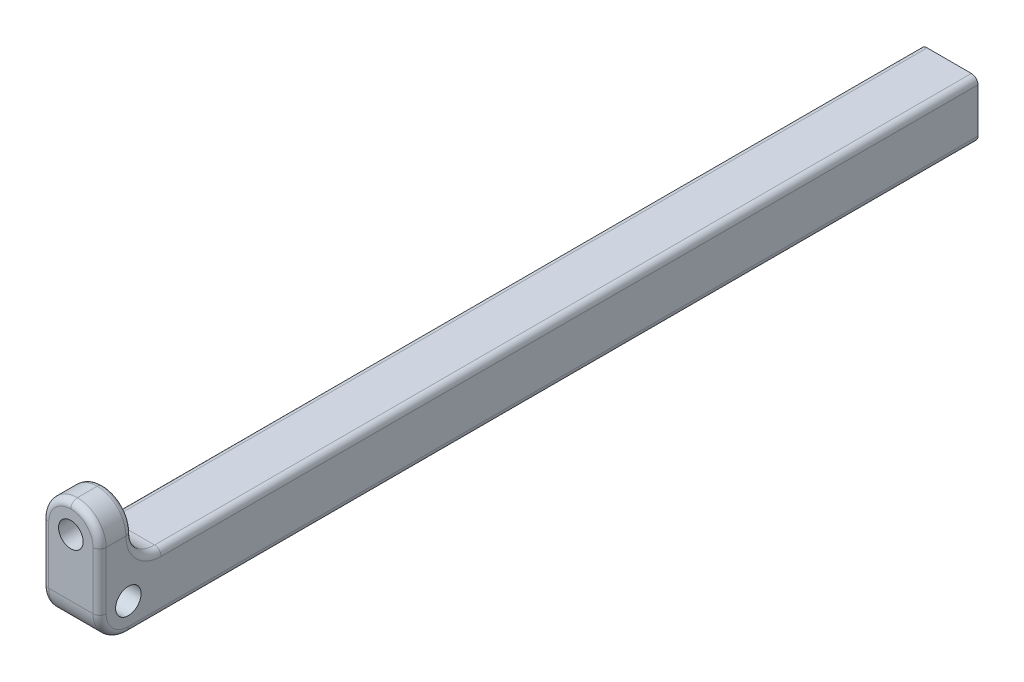
ISO-10303-21;
HEADER;
FILE_DESCRIPTION(('STEP AP214'),'2;1');
FILE_NAME('part.step','',(''),(''),'','','');
FILE_SCHEMA(('AUTOMOTIVE_DESIGN { 1 0 10303 214 1 1 1 1 }'));
ENDSEC;
DATA;
#1=APPLICATION_CONTEXT('core data for automotive mechanical design processes');
#2=APPLICATION_PROTOCOL_DEFINITION('international standard','automotive_design',2000,#1);
#3=PRODUCT_CONTEXT('',#1,'mechanical');
#4=PRODUCT('Part','Part','',(#3));
#5=PRODUCT_RELATED_PRODUCT_CATEGORY('part','',(#4));
#6=PRODUCT_DEFINITION_FORMATION('','',#4);
#7=PRODUCT_DEFINITION_CONTEXT('part definition',#1,'design');
#8=PRODUCT_DEFINITION('design','',#6,#7);
#9=PRODUCT_DEFINITION_SHAPE('','',#8);
#10=(LENGTH_UNIT() NAMED_UNIT(*) SI_UNIT(.MILLI.,.METRE.));
#11=(NAMED_UNIT(*) PLANE_ANGLE_UNIT() SI_UNIT($,.RADIAN.));
#12=(NAMED_UNIT(*) SI_UNIT($,.STERADIAN.) SOLID_ANGLE_UNIT());
#13=UNCERTAINTY_MEASURE_WITH_UNIT(LENGTH_MEASURE(1.E-05),#10,'distance_accuracy_value','');
#14=(GEOMETRIC_REPRESENTATION_CONTEXT(3) GLOBAL_UNCERTAINTY_ASSIGNED_CONTEXT((#13)) GLOBAL_UNIT_ASSIGNED_CONTEXT((#10,
#11,#12)) REPRESENTATION_CONTEXT('',''));
#15=CARTESIAN_POINT('',(0.,0.,0.));
#16=DIRECTION('',(0.,0.,1.));
#17=DIRECTION('',(1.,0.,0.));
#18=AXIS2_PLACEMENT_3D('',#15,#16,#17);
#19=CARTESIAN_POINT('',(-3.5,3.5,107.));
#20=DIRECTION('',(0.,-1.,0.));
#21=DIRECTION('',(0.,0.,-1.));
#22=AXIS2_PLACEMENT_3D('',#19,#20,#21);
#23=PLANE('',#22);
#24=DIRECTION('',(-1.,0.,0.));
#25=VECTOR('',#24,1.);
#26=CARTESIAN_POINT('',(3.5,3.5,99.5));
#27=LINE('',#26,#25);
#28=CARTESIAN_POINT('',(-2.7,3.5,99.5));
#29=VERTEX_POINT('',#28);
#30=CARTESIAN_POINT('',(2.7,3.5,99.5));
#31=VERTEX_POINT('',#30);
#32=EDGE_CURVE('E162',#29,#31,#27,.F.);
#33=ORIENTED_EDGE('',*,*,#32,.T.);
#34=DIRECTION('',(0.,0.,-1.));
#35=VECTOR('',#34,1.);
#36=CARTESIAN_POINT('',(2.7,3.5,107.));
#37=LINE('',#36,#35);
#38=CARTESIAN_POINT('',(2.7,3.5,0.));
#39=VERTEX_POINT('',#38);
#40=EDGE_CURVE('E623',#31,#39,#37,.T.);
#41=ORIENTED_EDGE('',*,*,#40,.T.);
#42=DIRECTION('',(-1.,0.,0.));
#43=VECTOR('',#42,1.);
#44=CARTESIAN_POINT('',(-3.5,3.5,0.));
#45=LINE('',#44,#43);
#46=CARTESIAN_POINT('',(-2.7,3.5,0.));
#47=VERTEX_POINT('',#46);
#48=EDGE_CURVE('E394',#39,#47,#45,.T.);
#49=ORIENTED_EDGE('',*,*,#48,.T.);
#50=DIRECTION('',(0.,0.,-1.));
#51=VECTOR('',#50,1.);
#52=CARTESIAN_POINT('',(-2.7,3.5,107.));
#53=LINE('',#52,#51);
#54=EDGE_CURVE('E161',#47,#29,#53,.F.);
#55=ORIENTED_EDGE('',*,*,#54,.T.);
#56=EDGE_LOOP('',(#33,#41,#49,#55));
#57=FACE_BOUND('',#56,.T.);
#58=ADVANCED_FACE('F35',(#57),#23,.F.);
#59=CARTESIAN_POINT('',(3.5,3.5,107.));
#60=DIRECTION('',(-1.,0.,0.));
#61=DIRECTION('',(0.,-1.,0.));
#62=AXIS2_PLACEMENT_3D('',#59,#60,#61);
#63=PLANE('',#62);
#64=CARTESIAN_POINT('',(3.5,0.,103.5));
#65=DIRECTION('',(1.,0.,0.));
#66=DIRECTION('',(0.,1.,0.));
#67=AXIS2_PLACEMENT_3D('',#64,#65,#66);
#68=CIRCLE('',#67,1.54999999999999);
#69=CARTESIAN_POINT('',(3.5,1.54999999999999,103.5));
#70=VERTEX_POINT('',#69);
#71=EDGE_CURVE('E294',#70,#70,#68,.T.);
#72=ORIENTED_EDGE('',*,*,#71,.F.);
#73=EDGE_LOOP('',(#72));
#74=FACE_BOUND('',#73,.T.);
#75=CARTESIAN_POINT('',(3.5,0.,103.5));
#76=DIRECTION('',(-1.,0.,0.));
#77=DIRECTION('',(0.,-1.,0.));
#78=AXIS2_PLACEMENT_3D('',#75,#76,#77);
#79=CIRCLE('',#78,2.7);
#80=CARTESIAN_POINT('',(3.5,0.,106.2));
#81=VERTEX_POINT('',#80);
#82=CARTESIAN_POINT('',(3.5,-2.7,103.5));
#83=VERTEX_POINT('',#82);
#84=EDGE_CURVE('E353',#81,#83,#79,.F.);
#85=ORIENTED_EDGE('',*,*,#84,.T.);
#86=DIRECTION('',(0.,0.,-1.));
#87=VECTOR('',#86,1.);
#88=CARTESIAN_POINT('',(3.5,-2.7,107.));
#89=LINE('',#88,#87);
#90=CARTESIAN_POINT('',(3.5,-2.7,0.));
#91=VERTEX_POINT('',#90);
#92=EDGE_CURVE('E355',#83,#91,#89,.T.);
#93=ORIENTED_EDGE('',*,*,#92,.T.);
#94=DIRECTION('',(0.,1.,0.));
#95=VECTOR('',#94,1.);
#96=CARTESIAN_POINT('',(3.5,3.5,0.));
#97=LINE('',#96,#95);
#98=CARTESIAN_POINT('',(3.5,2.7,0.));
#99=VERTEX_POINT('',#98);
#100=EDGE_CURVE('E397',#91,#99,#97,.T.);
#101=ORIENTED_EDGE('',*,*,#100,.T.);
#102=DIRECTION('',(0.,0.,-1.));
#103=VECTOR('',#102,1.);
#104=CARTESIAN_POINT('',(3.5,2.7,107.));
#105=LINE('',#104,#103);
#106=CARTESIAN_POINT('',(3.5,2.7,99.5));
#107=VERTEX_POINT('',#106);
#108=EDGE_CURVE('E630',#99,#107,#105,.F.);
#109=ORIENTED_EDGE('',*,*,#108,.T.);
#110=CARTESIAN_POINT('',(3.5,7.,99.5));
#111=DIRECTION('',(-1.,0.,0.));
#112=DIRECTION('',(0.,-1.,0.));
#113=AXIS2_PLACEMENT_3D('',#110,#111,#112);
#114=CIRCLE('',#113,4.3);
#115=CARTESIAN_POINT('',(3.5,7.,103.8));
#116=VERTEX_POINT('',#115);
#117=EDGE_CURVE('E381',#107,#116,#114,.T.);
#118=ORIENTED_EDGE('',*,*,#117,.T.);
#119=DIRECTION('',(0.,0.,-1.));
#120=VECTOR('',#119,1.);
#121=CARTESIAN_POINT('',(3.5,7.,107.));
#122=LINE('',#121,#120);
#123=CARTESIAN_POINT('',(3.5,7.,106.2));
#124=VERTEX_POINT('',#123);
#125=EDGE_CURVE('E180',#116,#124,#122,.F.);
#126=ORIENTED_EDGE('',*,*,#125,.T.);
#127=DIRECTION('',(0.,1.,0.));
#128=VECTOR('',#127,1.);
#129=CARTESIAN_POINT('',(3.5,0.,106.2));
#130=LINE('',#129,#128);
#131=EDGE_CURVE('E351',#124,#81,#130,.F.);
#132=ORIENTED_EDGE('',*,*,#131,.T.);
#133=EDGE_LOOP('',(#85,#93,#101,#109,#118,#126,#132));
#134=FACE_BOUND('',#133,.T.);
#135=ADVANCED_FACE('F257',(#74,#134),#63,.F.);
#136=CARTESIAN_POINT('',(-3.5,3.5,107.));
#137=DIRECTION('',(1.,0.,0.));
#138=DIRECTION('',(0.,1.,0.));
#139=AXIS2_PLACEMENT_3D('',#136,#137,#138);
#140=PLANE('',#139);
#141=CARTESIAN_POINT('',(-3.5,0.,103.5));
#142=DIRECTION('',(1.,0.,0.));
#143=DIRECTION('',(0.,1.,0.));
#144=AXIS2_PLACEMENT_3D('',#141,#142,#143);
#145=CIRCLE('',#144,1.54999999999999);
#146=CARTESIAN_POINT('',(-3.5,1.54999999999999,103.5));
#147=VERTEX_POINT('',#146);
#148=EDGE_CURVE('E399',#147,#147,#145,.T.);
#149=ORIENTED_EDGE('',*,*,#148,.T.);
#150=EDGE_LOOP('',(#149));
#151=FACE_BOUND('',#150,.T.);
#152=CARTESIAN_POINT('',(-3.5,0.,103.5));
#153=DIRECTION('',(1.,0.,0.));
#154=DIRECTION('',(0.,1.,0.));
#155=AXIS2_PLACEMENT_3D('',#152,#153,#154);
#156=CIRCLE('',#155,2.7);
#157=CARTESIAN_POINT('',(-3.5,-2.7,103.5));
#158=VERTEX_POINT('',#157);
#159=CARTESIAN_POINT('',(-3.5,0.,106.2));
#160=VERTEX_POINT('',#159);
#161=EDGE_CURVE('E44',#158,#160,#156,.F.);
#162=ORIENTED_EDGE('',*,*,#161,.T.);
#163=DIRECTION('',(0.,-1.,0.));
#164=VECTOR('',#163,1.);
#165=CARTESIAN_POINT('',(-3.5,7.,106.2));
#166=LINE('',#165,#164);
#167=CARTESIAN_POINT('',(-3.5,7.,106.2));
#168=VERTEX_POINT('',#167);
#169=EDGE_CURVE('E11',#160,#168,#166,.F.);
#170=ORIENTED_EDGE('',*,*,#169,.T.);
#171=DIRECTION('',(0.,0.,1.));
#172=VECTOR('',#171,1.);
#173=CARTESIAN_POINT('',(-3.5,7.,107.));
#174=LINE('',#173,#172);
#175=CARTESIAN_POINT('',(-3.5,7.,103.8));
#176=VERTEX_POINT('',#175);
#177=EDGE_CURVE('E177',#168,#176,#174,.F.);
#178=ORIENTED_EDGE('',*,*,#177,.T.);
#179=CARTESIAN_POINT('',(-3.5,7.,99.5));
#180=DIRECTION('',(1.,0.,0.));
#181=DIRECTION('',(0.,1.,0.));
#182=AXIS2_PLACEMENT_3D('',#179,#180,#181);
#183=CIRCLE('',#182,4.3);
#184=CARTESIAN_POINT('',(-3.5,2.7,99.5));
#185=VERTEX_POINT('',#184);
#186=EDGE_CURVE('E341',#176,#185,#183,.T.);
#187=ORIENTED_EDGE('',*,*,#186,.T.);
#188=DIRECTION('',(0.,0.,-1.));
#189=VECTOR('',#188,1.);
#190=CARTESIAN_POINT('',(-3.5,2.7,107.));
#191=LINE('',#190,#189);
#192=CARTESIAN_POINT('',(-3.5,2.7,0.));
#193=VERTEX_POINT('',#192);
#194=EDGE_CURVE('E602',#185,#193,#191,.T.);
#195=ORIENTED_EDGE('',*,*,#194,.T.);
#196=DIRECTION('',(0.,-1.,0.));
#197=VECTOR('',#196,1.);
#198=CARTESIAN_POINT('',(-3.5,3.5,0.));
#199=LINE('',#198,#197);
#200=CARTESIAN_POINT('',(-3.5,-2.7,0.));
#201=VERTEX_POINT('',#200);
#202=EDGE_CURVE('E392',#193,#201,#199,.T.);
#203=ORIENTED_EDGE('',*,*,#202,.T.);
#204=DIRECTION('',(0.,0.,-1.));
#205=VECTOR('',#204,1.);
#206=CARTESIAN_POINT('',(-3.5,-2.7,107.));
#207=LINE('',#206,#205);
#208=EDGE_CURVE('E55',#201,#158,#207,.F.);
#209=ORIENTED_EDGE('',*,*,#208,.T.);
#210=EDGE_LOOP('',(#162,#170,#178,#187,#195,#203,#209));
#211=FACE_BOUND('',#210,.T.);
#212=ADVANCED_FACE('F263',(#151,#211),#140,.F.);
#213=CARTESIAN_POINT('',(-3.5,-3.5,107.));
#214=DIRECTION('',(0.,1.,0.));
#215=DIRECTION('',(0.,0.,1.));
#216=AXIS2_PLACEMENT_3D('',#213,#214,#215);
#217=PLANE('',#216);
#218=DIRECTION('',(1.,0.,0.));
#219=VECTOR('',#218,1.);
#220=CARTESIAN_POINT('',(-3.5,-3.5,0.));
#221=LINE('',#220,#219);
#222=CARTESIAN_POINT('',(-2.7,-3.5,0.));
#223=VERTEX_POINT('',#222);
#224=CARTESIAN_POINT('',(2.7,-3.5,0.));
#225=VERTEX_POINT('',#224);
#226=EDGE_CURVE('E389',#223,#225,#221,.T.);
#227=ORIENTED_EDGE('',*,*,#226,.T.);
#228=DIRECTION('',(0.,0.,-1.));
#229=VECTOR('',#228,1.);
#230=CARTESIAN_POINT('',(2.7,-3.5,107.));
#231=LINE('',#230,#229);
#232=CARTESIAN_POINT('',(2.7,-3.5,103.5));
#233=VERTEX_POINT('',#232);
#234=EDGE_CURVE('E364',#225,#233,#231,.F.);
#235=ORIENTED_EDGE('',*,*,#234,.T.);
#236=DIRECTION('',(1.,0.,0.));
#237=VECTOR('',#236,1.);
#238=CARTESIAN_POINT('',(-3.5,-3.5,103.5));
#239=LINE('',#238,#237);
#240=CARTESIAN_POINT('',(-2.7,-3.5,103.5));
#241=VERTEX_POINT('',#240);
#242=EDGE_CURVE('E382',#233,#241,#239,.F.);
#243=ORIENTED_EDGE('',*,*,#242,.T.);
#244=DIRECTION('',(0.,0.,-1.));
#245=VECTOR('',#244,1.);
#246=CARTESIAN_POINT('',(-2.7,-3.5,107.));
#247=LINE('',#246,#245);
#248=EDGE_CURVE('E362',#241,#223,#247,.T.);
#249=ORIENTED_EDGE('',*,*,#248,.T.);
#250=EDGE_LOOP('',(#227,#235,#243,#249));
#251=FACE_BOUND('',#250,.T.);
#252=ADVANCED_FACE('F408',(#251),#217,.F.);
#253=CARTESIAN_POINT('',(0.,0.,107.));
#254=DIRECTION('',(0.,0.,1.));
#255=DIRECTION('',(1.,0.,0.));
#256=AXIS2_PLACEMENT_3D('',#253,#254,#255);
#257=PLANE('',#256);
#258=CARTESIAN_POINT('',(0.,7.,107.));
#259=DIRECTION('',(0.,0.,-1.));
#260=DIRECTION('',(-1.,0.,0.));
#261=AXIS2_PLACEMENT_3D('',#258,#259,#260);
#262=CIRCLE('',#261,1.5);
#263=CARTESIAN_POINT('',(-1.5,7.,107.));
#264=VERTEX_POINT('',#263);
#265=EDGE_CURVE('E170',#264,#264,#262,.T.);
#266=ORIENTED_EDGE('',*,*,#265,.T.);
#267=EDGE_LOOP('',(#266));
#268=FACE_BOUND('',#267,.T.);
#269=DIRECTION('',(1.,0.,0.));
#270=VECTOR('',#269,1.);
#271=CARTESIAN_POINT('',(3.5,0.,107.));
#272=LINE('',#271,#270);
#273=CARTESIAN_POINT('',(-2.7,0.,107.));
#274=VERTEX_POINT('',#273);
#275=CARTESIAN_POINT('',(2.7,0.,107.));
#276=VERTEX_POINT('',#275);
#277=EDGE_CURVE('E385',#274,#276,#272,.T.);
#278=ORIENTED_EDGE('',*,*,#277,.T.);
#279=DIRECTION('',(0.,1.,0.));
#280=VECTOR('',#279,1.);
#281=CARTESIAN_POINT('',(2.7,7.,107.));
#282=LINE('',#281,#280);
#283=CARTESIAN_POINT('',(2.7,7.,107.));
#284=VERTEX_POINT('',#283);
#285=EDGE_CURVE('E309',#276,#284,#282,.T.);
#286=ORIENTED_EDGE('',*,*,#285,.T.);
#287=CARTESIAN_POINT('',(0.,7.,107.));
#288=DIRECTION('',(0.,0.,1.));
#289=DIRECTION('',(1.,0.,0.));
#290=AXIS2_PLACEMENT_3D('',#287,#288,#289);
#291=CIRCLE('',#290,2.7);
#292=CARTESIAN_POINT('',(0.,9.7,107.));
#293=VERTEX_POINT('',#292);
#294=EDGE_CURVE('E312',#284,#293,#291,.T.);
#295=ORIENTED_EDGE('',*,*,#294,.T.);
#296=CARTESIAN_POINT('',(0.,7.,107.));
#297=DIRECTION('',(0.,0.,1.));
#298=DIRECTION('',(1.,0.,0.));
#299=AXIS2_PLACEMENT_3D('',#296,#297,#298);
#300=CIRCLE('',#299,2.7);
#301=CARTESIAN_POINT('',(-2.7,7.,107.));
#302=VERTEX_POINT('',#301);
#303=EDGE_CURVE('E301',#293,#302,#300,.T.);
#304=ORIENTED_EDGE('',*,*,#303,.T.);
#305=DIRECTION('',(0.,-1.,0.));
#306=VECTOR('',#305,1.);
#307=CARTESIAN_POINT('',(-2.7,0.,107.));
#308=LINE('',#307,#306);
#309=EDGE_CURVE('E370',#302,#274,#308,.T.);
#310=ORIENTED_EDGE('',*,*,#309,.T.);
#311=EDGE_LOOP('',(#278,#286,#295,#304,#310));
#312=FACE_BOUND('',#311,.T.);
#313=ADVANCED_FACE('F374',(#268,#312),#257,.T.);
#314=CARTESIAN_POINT('',(0.,0.,0.));
#315=DIRECTION('',(0.,0.,1.));
#316=DIRECTION('',(1.,0.,0.));
#317=AXIS2_PLACEMENT_3D('',#314,#315,#316);
#318=PLANE('',#317);
#319=ORIENTED_EDGE('',*,*,#100,.F.);
#320=CARTESIAN_POINT('',(2.7,-2.7,0.));
#321=DIRECTION('',(0.,0.,1.));
#322=DIRECTION('',(1.,0.,0.));
#323=AXIS2_PLACEMENT_3D('',#320,#321,#322);
#324=CIRCLE('',#323,0.8);
#325=EDGE_CURVE('E360',#91,#225,#324,.F.);
#326=ORIENTED_EDGE('',*,*,#325,.T.);
#327=ORIENTED_EDGE('',*,*,#226,.F.);
#328=CARTESIAN_POINT('',(-2.7,-2.7,0.));
#329=DIRECTION('',(0.,0.,1.));
#330=DIRECTION('',(1.,0.,0.));
#331=AXIS2_PLACEMENT_3D('',#328,#329,#330);
#332=CIRCLE('',#331,0.8);
#333=EDGE_CURVE('E358',#223,#201,#332,.F.);
#334=ORIENTED_EDGE('',*,*,#333,.T.);
#335=ORIENTED_EDGE('',*,*,#202,.F.);
#336=CARTESIAN_POINT('',(-2.7,2.7,0.));
#337=DIRECTION('',(0.,0.,1.));
#338=DIRECTION('',(1.,0.,0.));
#339=AXIS2_PLACEMENT_3D('',#336,#337,#338);
#340=CIRCLE('',#339,0.8);
#341=EDGE_CURVE('E620',#193,#47,#340,.F.);
#342=ORIENTED_EDGE('',*,*,#341,.T.);
#343=ORIENTED_EDGE('',*,*,#48,.F.);
#344=CARTESIAN_POINT('',(2.7,2.7,0.));
#345=DIRECTION('',(0.,0.,1.));
#346=DIRECTION('',(1.,0.,0.));
#347=AXIS2_PLACEMENT_3D('',#344,#345,#346);
#348=CIRCLE('',#347,0.8);
#349=EDGE_CURVE('E622',#39,#99,#348,.F.);
#350=ORIENTED_EDGE('',*,*,#349,.T.);
#351=EDGE_LOOP('',(#319,#326,#327,#334,#335,#342,#343,#350));
#352=FACE_BOUND('',#351,.T.);
#353=ADVANCED_FACE('F272',(#352),#318,.F.);
#354=CARTESIAN_POINT('',(0.,0.,103.5));
#355=DIRECTION('',(-1.,0.,0.));
#356=DIRECTION('',(0.,0.,1.));
#357=AXIS2_PLACEMENT_3D('',#354,#355,#356);
#358=CYLINDRICAL_SURFACE('',#357,3.5);
#359=ORIENTED_EDGE('',*,*,#242,.F.);
#360=CARTESIAN_POINT('',(2.7,0.,103.5));
#361=DIRECTION('',(-1.,0.,0.));
#362=DIRECTION('',(0.,-1.,0.));
#363=AXIS2_PLACEMENT_3D('',#360,#361,#362);
#364=CIRCLE('',#363,3.5);
#365=EDGE_CURVE('E368',#233,#276,#364,.T.);
#366=ORIENTED_EDGE('',*,*,#365,.T.);
#367=ORIENTED_EDGE('',*,*,#277,.F.);
#368=CARTESIAN_POINT('',(-2.7,0.,103.5));
#369=DIRECTION('',(1.,0.,0.));
#370=DIRECTION('',(0.,1.,0.));
#371=AXIS2_PLACEMENT_3D('',#368,#369,#370);
#372=CIRCLE('',#371,3.5);
#373=EDGE_CURVE('E366',#274,#241,#372,.T.);
#374=ORIENTED_EDGE('',*,*,#373,.T.);
#375=EDGE_LOOP('',(#359,#366,#367,#374));
#376=FACE_BOUND('',#375,.T.);
#377=ADVANCED_FACE('F269',(#376),#358,.T.);
#378=CARTESIAN_POINT('',(-3.5,0.,103.5));
#379=DIRECTION('',(1.,0.,0.));
#380=DIRECTION('',(0.,1.,0.));
#381=AXIS2_PLACEMENT_3D('',#378,#379,#380);
#382=CYLINDRICAL_SURFACE('',#381,1.54999999999999);
#383=ORIENTED_EDGE('',*,*,#148,.F.);
#384=EDGE_LOOP('',(#383));
#385=FACE_BOUND('',#384,.T.);
#386=ORIENTED_EDGE('',*,*,#71,.T.);
#387=EDGE_LOOP('',(#386));
#388=FACE_BOUND('',#387,.T.);
#389=ADVANCED_FACE('F271',(#385,#388),#382,.F.);
#390=CARTESIAN_POINT('',(-3.5,10.5,103.));
#391=DIRECTION('',(0.,0.,1.));
#392=DIRECTION('',(1.,0.,0.));
#393=AXIS2_PLACEMENT_3D('',#390,#391,#392);
#394=PLANE('',#393);
#395=CARTESIAN_POINT('',(0.,7.,103.));
#396=DIRECTION('',(0.,0.,1.));
#397=DIRECTION('',(1.,0.,0.));
#398=AXIS2_PLACEMENT_3D('',#395,#396,#397);
#399=CIRCLE('',#398,2.7);
#400=CARTESIAN_POINT('',(-2.7,7.,103.));
#401=VERTEX_POINT('',#400);
#402=CARTESIAN_POINT('',(0.,9.7,103.));
#403=VERTEX_POINT('',#402);
#404=EDGE_CURVE('E607',#401,#403,#399,.F.);
#405=ORIENTED_EDGE('',*,*,#404,.T.);
#406=CARTESIAN_POINT('',(0.,7.,103.));
#407=DIRECTION('',(0.,0.,1.));
#408=DIRECTION('',(1.,0.,0.));
#409=AXIS2_PLACEMENT_3D('',#406,#407,#408);
#410=CIRCLE('',#409,2.7);
#411=CARTESIAN_POINT('',(2.7,7.,103.));
#412=VERTEX_POINT('',#411);
#413=EDGE_CURVE('E609',#403,#412,#410,.F.);
#414=ORIENTED_EDGE('',*,*,#413,.T.);
#415=DIRECTION('',(-1.,0.,0.));
#416=VECTOR('',#415,1.);
#417=CARTESIAN_POINT('',(-3.5,7.,103.));
#418=LINE('',#417,#416);
#419=CARTESIAN_POINT('',(1.5,7.,103.));
#420=VERTEX_POINT('',#419);
#421=EDGE_CURVE('E169',#412,#420,#418,.T.);
#422=ORIENTED_EDGE('',*,*,#421,.T.);
#423=CARTESIAN_POINT('',(0.,7.,103.));
#424=DIRECTION('',(0.,0.,-1.));
#425=DIRECTION('',(-1.,0.,0.));
#426=AXIS2_PLACEMENT_3D('',#423,#424,#425);
#427=CIRCLE('',#426,1.5);
#428=CARTESIAN_POINT('',(-1.5,7.,103.));
#429=VERTEX_POINT('',#428);
#430=EDGE_CURVE('E157',#429,#420,#427,.T.);
#431=ORIENTED_EDGE('',*,*,#430,.F.);
#432=DIRECTION('',(-1.,0.,0.));
#433=VECTOR('',#432,1.);
#434=CARTESIAN_POINT('',(-3.5,7.,103.));
#435=LINE('',#434,#433);
#436=EDGE_CURVE('E167',#429,#401,#435,.T.);
#437=ORIENTED_EDGE('',*,*,#436,.T.);
#438=EDGE_LOOP('',(#405,#414,#422,#431,#437));
#439=FACE_BOUND('',#438,.T.);
#440=ADVANCED_FACE('F166',(#439),#394,.F.);
#441=CARTESIAN_POINT('',(0.,7.,0.));
#442=DIRECTION('',(0.,0.,1.));
#443=DIRECTION('',(1.,0.,0.));
#444=AXIS2_PLACEMENT_3D('',#441,#442,#443);
#445=CYLINDRICAL_SURFACE('',#444,3.5);
#446=ORIENTED_EDGE('',*,*,#177,.F.);
#447=CARTESIAN_POINT('',(0.,7.,106.2));
#448=DIRECTION('',(0.,0.,1.));
#449=DIRECTION('',(1.,0.,0.));
#450=AXIS2_PLACEMENT_3D('',#447,#448,#449);
#451=CIRCLE('',#450,3.5);
#452=CARTESIAN_POINT('',(0.,10.5,106.2));
#453=VERTEX_POINT('',#452);
#454=EDGE_CURVE('E300',#168,#453,#451,.F.);
#455=ORIENTED_EDGE('',*,*,#454,.T.);
#456=DIRECTION('',(0.,0.,1.));
#457=VECTOR('',#456,1.);
#458=CARTESIAN_POINT('',(0.,10.5,0.));
#459=LINE('',#458,#457);
#460=CARTESIAN_POINT('',(0.,10.5,103.8));
#461=VERTEX_POINT('',#460);
#462=EDGE_CURVE('E183',#461,#453,#459,.T.);
#463=ORIENTED_EDGE('',*,*,#462,.F.);
#464=CARTESIAN_POINT('',(0.,7.,103.8));
#465=DIRECTION('',(0.,0.,1.));
#466=DIRECTION('',(1.,0.,0.));
#467=AXIS2_PLACEMENT_3D('',#464,#465,#466);
#468=CIRCLE('',#467,3.5);
#469=EDGE_CURVE('E599',#461,#176,#468,.T.);
#470=ORIENTED_EDGE('',*,*,#469,.T.);
#471=EDGE_LOOP('',(#446,#455,#463,#470));
#472=FACE_BOUND('',#471,.T.);
#473=ADVANCED_FACE('F200',(#472),#445,.T.);
#474=CARTESIAN_POINT('',(0.,7.,0.));
#475=DIRECTION('',(0.,0.,-1.));
#476=DIRECTION('',(-1.,0.,0.));
#477=AXIS2_PLACEMENT_3D('',#474,#475,#476);
#478=CYLINDRICAL_SURFACE('',#477,3.5);
#479=ORIENTED_EDGE('',*,*,#462,.T.);
#480=CARTESIAN_POINT('',(0.,7.,106.2));
#481=DIRECTION('',(0.,0.,1.));
#482=DIRECTION('',(1.,0.,0.));
#483=AXIS2_PLACEMENT_3D('',#480,#481,#482);
#484=CIRCLE('',#483,3.5);
#485=EDGE_CURVE('E288',#453,#124,#484,.F.);
#486=ORIENTED_EDGE('',*,*,#485,.T.);
#487=ORIENTED_EDGE('',*,*,#125,.F.);
#488=CARTESIAN_POINT('',(0.,7.,103.8));
#489=DIRECTION('',(0.,0.,1.));
#490=DIRECTION('',(1.,0.,0.));
#491=AXIS2_PLACEMENT_3D('',#488,#489,#490);
#492=CIRCLE('',#491,3.5);
#493=EDGE_CURVE('E291',#116,#461,#492,.T.);
#494=ORIENTED_EDGE('',*,*,#493,.T.);
#495=EDGE_LOOP('',(#479,#486,#487,#494));
#496=FACE_BOUND('',#495,.T.);
#497=ADVANCED_FACE('F274',(#496),#478,.T.);
#498=CARTESIAN_POINT('',(0.,7.,107.));
#499=DIRECTION('',(0.,0.,-1.));
#500=DIRECTION('',(-1.,0.,0.));
#501=AXIS2_PLACEMENT_3D('',#498,#499,#500);
#502=CYLINDRICAL_SURFACE('',#501,1.5);
#503=ORIENTED_EDGE('',*,*,#265,.F.);
#504=EDGE_LOOP('',(#503));
#505=FACE_BOUND('',#504,.T.);
#506=ORIENTED_EDGE('',*,*,#430,.T.);
#507=CARTESIAN_POINT('',(1.5,7.,103.));
#508=CARTESIAN_POINT('',(1.50000159983831,6.9597415283229,103.000003666925));
#509=CARTESIAN_POINT('',(1.49837817272655,6.91950395310507,102.999304602513));
#510=CARTESIAN_POINT('',(1.4919140751151,6.83934822420712,102.996540430804));
#511=CARTESIAN_POINT('',(1.48707445349108,6.79942997068263,102.994475768861));
#512=CARTESIAN_POINT('',(1.46783828858326,6.68089698532663,102.986316973753));
#513=CARTESIAN_POINT('',(1.44872372831005,6.60312742892657,102.978257285139));
#514=CARTESIAN_POINT('',(1.39867829139033,6.45225533620262,102.957714042103));
#515=CARTESIAN_POINT('',(1.36775697588669,6.37914907928545,102.945234067832));
#516=CARTESIAN_POINT('',(1.29511299735699,6.23914056270388,102.917045182967));
#517=CARTESIAN_POINT('',(1.25338162756063,6.17224336328541,102.9013336717));
#518=CARTESIAN_POINT('',(1.15803343480175,6.04307418561765,102.86733817048));
#519=CARTESIAN_POINT('',(1.1039464029826,5.98117257364693,102.848967463309));
#520=CARTESIAN_POINT('',(0.98642111015564,5.86699944457933,102.812086233516));
#521=CARTESIAN_POINT('',(0.922978711819272,5.8147322113306,102.793575652489));
#522=CARTESIAN_POINT('',(0.784482896470159,5.7185709460044,102.757410085326));
#523=CARTESIAN_POINT('',(0.708993188231113,5.67526500523536,102.739851934487));
#524=CARTESIAN_POINT('',(0.550943554704525,5.60213340526187,102.708980562628));
#525=CARTESIAN_POINT('',(0.468387657196736,5.5723001266127,102.695664943509));
#526=CARTESIAN_POINT('',(0.30285049575992,5.52852562169275,102.675739099446));
#527=CARTESIAN_POINT('',(0.220097924974592,5.51386283898494,102.668826254003));
#528=CARTESIAN_POINT('',(0.0530388238873895,5.49859698101096,102.661624256339));
#529=CARTESIAN_POINT('',(-0.0312667812639527,5.49798578995852,102.661331280678));
#530=CARTESIAN_POINT('',(-0.191650666149874,5.51030005558435,102.667147895362));
#531=CARTESIAN_POINT('',(-0.267836728457273,5.52211964746324,102.672734459767));
#532=CARTESIAN_POINT('',(-0.417015151605332,5.55709657018014,102.688792252467));
#533=CARTESIAN_POINT('',(-0.490006914440779,5.58025601414555,102.69926439115));
#534=CARTESIAN_POINT('',(-0.632623007242606,5.63771146190458,102.724153328995));
#535=CARTESIAN_POINT('',(-0.702139048396519,5.67223953031782,102.738651246209));
#536=CARTESIAN_POINT('',(-0.834672177660201,5.75128783063792,102.769942206907));
#537=CARTESIAN_POINT('',(-0.897686505353334,5.79581228141268,102.786736218259));
#538=CARTESIAN_POINT('',(-1.02138563307292,5.89828018790833,102.822561121266));
#539=CARTESIAN_POINT('',(-1.08135251529124,5.95706985212871,102.841657424268));
#540=CARTESIAN_POINT('',(-1.19083110619284,6.0840576174516,102.878671318843));
#541=CARTESIAN_POINT('',(-1.24033906959846,6.15225907445757,102.8965884866));
#542=CARTESIAN_POINT('',(-1.32864423290454,6.29844121244985,102.929806897219));
#543=CARTESIAN_POINT('',(-1.36712720757692,6.37663111511198,102.945027405583));
#544=CARTESIAN_POINT('',(-1.43010127646302,6.53915816476414,102.970497680341));
#545=CARTESIAN_POINT('',(-1.45461458939198,6.62348530818185,102.980755336192));
#546=CARTESIAN_POINT('',(-1.48102199795955,6.75720476824037,102.991898918538));
#547=CARTESIAN_POINT('',(-1.48812733591244,6.80544722198627,102.994923973976));
#548=CARTESIAN_POINT('',(-1.49761805974819,6.90244931926884,102.998978767473));
#549=CARTESIAN_POINT('',(-1.50000604656874,6.95120866289681,103.000009605048));
#550=CARTESIAN_POINT('',(-1.5,7.,103.));
#551=B_SPLINE_CURVE_WITH_KNOTS('',3,(#507,#508,#509,#510,#511,#512,#513,#514,#515,#516,#517,
#518,#519,#520,#521,#522,#523,#524,#525,#526,#527,#528,#529,#530,#531,#532,#533,#534,#535,#536,
#537,#538,#539,#540,#541,#542,#543,#544,#545,#546,#547,#548,#549,#550),.UNSPECIFIED.,.F.,.F.,(4,
2,2,2,2,2,2,2,2,2,2,2,2,2,2,2,2,2,2,2,2,4),(0.,0.120696005170523,0.241352667876326,
0.481551501872268,0.721556233313276,0.961754876722222,1.21335708062581,1.46507088895447,
1.7300801432795,1.99493933372928,2.24652401974591,2.49796339419108,2.72878531379159,
2.95965026233584,3.19555476757738,3.43155902161163,3.68876641968484,3.94606576668309,
4.21009898736293,4.47371108328838,4.62003565626656,4.76627952983873),.UNSPECIFIED.);
#552=EDGE_CURVE('E154',#420,#429,#551,.T.);
#553=ORIENTED_EDGE('',*,*,#552,.T.);
#554=EDGE_LOOP('',(#506,#553));
#555=FACE_BOUND('',#554,.T.);
#556=ADVANCED_FACE('F156',(#505,#555),#502,.F.);
#557=CARTESIAN_POINT('',(-3.5,7.,99.5));
#558=DIRECTION('',(1.,0.,0.));
#559=DIRECTION('',(0.,0.,-1.));
#560=AXIS2_PLACEMENT_3D('',#557,#558,#559);
#561=CYLINDRICAL_SURFACE('',#560,3.5);
#562=ORIENTED_EDGE('',*,*,#421,.F.);
#563=CARTESIAN_POINT('',(2.7,7.,99.5));
#564=DIRECTION('',(-1.,0.,0.));
#565=DIRECTION('',(0.,-1.,0.));
#566=AXIS2_PLACEMENT_3D('',#563,#564,#565);
#567=CIRCLE('',#566,3.5);
#568=EDGE_CURVE('E610',#412,#31,#567,.F.);
#569=ORIENTED_EDGE('',*,*,#568,.T.);
#570=ORIENTED_EDGE('',*,*,#32,.F.);
#571=CARTESIAN_POINT('',(-2.7,7.,99.5));
#572=DIRECTION('',(1.,0.,0.));
#573=DIRECTION('',(0.,1.,0.));
#574=AXIS2_PLACEMENT_3D('',#571,#572,#573);
#575=CIRCLE('',#574,3.5);
#576=EDGE_CURVE('E176',#29,#401,#575,.F.);
#577=ORIENTED_EDGE('',*,*,#576,.T.);
#578=ORIENTED_EDGE('',*,*,#436,.F.);
#579=ORIENTED_EDGE('',*,*,#552,.F.);
#580=EDGE_LOOP('',(#562,#569,#570,#577,#578,#579));
#581=FACE_BOUND('',#580,.T.);
#582=ADVANCED_FACE('F173',(#581),#561,.F.);
#583=CARTESIAN_POINT('',(-2.7,2.7,107.));
#584=DIRECTION('',(0.,0.,-1.));
#585=DIRECTION('',(-1.,0.,0.));
#586=AXIS2_PLACEMENT_3D('',#583,#584,#585);
#587=CYLINDRICAL_SURFACE('',#586,0.8);
#588=ORIENTED_EDGE('',*,*,#341,.F.);
#589=ORIENTED_EDGE('',*,*,#194,.F.);
#590=CARTESIAN_POINT('',(-2.7,2.7,99.5));
#591=DIRECTION('',(0.,0.,1.));
#592=DIRECTION('',(1.,0.,0.));
#593=AXIS2_PLACEMENT_3D('',#590,#591,#592);
#594=CIRCLE('',#593,0.8);
#595=EDGE_CURVE('E171',#29,#185,#594,.T.);
#596=ORIENTED_EDGE('',*,*,#595,.F.);
#597=ORIENTED_EDGE('',*,*,#54,.F.);
#598=EDGE_LOOP('',(#588,#589,#596,#597));
#599=FACE_BOUND('',#598,.T.);
#600=ADVANCED_FACE('F199',(#599),#587,.T.);
#601=CARTESIAN_POINT('',(-2.7,7.,99.5));
#602=DIRECTION('',(1.,0.,0.));
#603=DIRECTION('',(0.,1.,0.));
#604=AXIS2_PLACEMENT_3D('',#601,#602,#603);
#605=TOROIDAL_SURFACE('',#604,4.3,0.8);
#606=ORIENTED_EDGE('',*,*,#595,.T.);
#607=ORIENTED_EDGE('',*,*,#186,.F.);
#608=CARTESIAN_POINT('',(-2.7,7.,103.8));
#609=DIRECTION('',(0.,1.,0.));
#610=DIRECTION('',(-1.,0.,0.));
#611=AXIS2_PLACEMENT_3D('',#608,#609,#610);
#612=CIRCLE('',#611,0.8);
#613=EDGE_CURVE('E346',#401,#176,#612,.T.);
#614=ORIENTED_EDGE('',*,*,#613,.F.);
#615=ORIENTED_EDGE('',*,*,#576,.F.);
#616=EDGE_LOOP('',(#606,#607,#614,#615));
#617=FACE_BOUND('',#616,.T.);
#618=ADVANCED_FACE('F217',(#617),#605,.T.);
#619=CARTESIAN_POINT('',(0.,7.,103.8));
#620=DIRECTION('',(0.,0.,1.));
#621=DIRECTION('',(1.,0.,0.));
#622=AXIS2_PLACEMENT_3D('',#619,#620,#621);
#623=TOROIDAL_SURFACE('',#622,2.7,0.8);
#624=ORIENTED_EDGE('',*,*,#613,.T.);
#625=ORIENTED_EDGE('',*,*,#469,.F.);
#626=CARTESIAN_POINT('',(0.,9.7,103.8));
#627=DIRECTION('',(1.,0.,0.));
#628=DIRECTION('',(0.,1.,0.));
#629=AXIS2_PLACEMENT_3D('',#626,#627,#628);
#630=CIRCLE('',#629,0.8);
#631=EDGE_CURVE('E338',#403,#461,#630,.T.);
#632=ORIENTED_EDGE('',*,*,#631,.F.);
#633=ORIENTED_EDGE('',*,*,#404,.F.);
#634=EDGE_LOOP('',(#624,#625,#632,#633));
#635=FACE_BOUND('',#634,.T.);
#636=ADVANCED_FACE('F213',(#635),#623,.T.);
#637=CARTESIAN_POINT('',(0.,7.,103.8));
#638=DIRECTION('',(0.,0.,1.));
#639=DIRECTION('',(1.,0.,0.));
#640=AXIS2_PLACEMENT_3D('',#637,#638,#639);
#641=TOROIDAL_SURFACE('',#640,2.7,0.8);
#642=ORIENTED_EDGE('',*,*,#631,.T.);
#643=ORIENTED_EDGE('',*,*,#493,.F.);
#644=CARTESIAN_POINT('',(2.7,7.,103.8));
#645=DIRECTION('',(0.,-1.,0.));
#646=DIRECTION('',(0.,0.,-1.));
#647=AXIS2_PLACEMENT_3D('',#644,#645,#646);
#648=CIRCLE('',#647,0.8);
#649=EDGE_CURVE('E332',#412,#116,#648,.T.);
#650=ORIENTED_EDGE('',*,*,#649,.F.);
#651=ORIENTED_EDGE('',*,*,#413,.F.);
#652=EDGE_LOOP('',(#642,#643,#650,#651));
#653=FACE_BOUND('',#652,.T.);
#654=ADVANCED_FACE('F209',(#653),#641,.T.);
#655=CARTESIAN_POINT('',(2.7,7.,99.5));
#656=DIRECTION('',(-1.,0.,0.));
#657=DIRECTION('',(0.,-1.,0.));
#658=AXIS2_PLACEMENT_3D('',#655,#656,#657);
#659=TOROIDAL_SURFACE('',#658,4.3,0.8);
#660=ORIENTED_EDGE('',*,*,#649,.T.);
#661=ORIENTED_EDGE('',*,*,#117,.F.);
#662=CARTESIAN_POINT('',(2.7,2.7,99.5));
#663=DIRECTION('',(0.,0.,-1.));
#664=DIRECTION('',(-1.,0.,0.));
#665=AXIS2_PLACEMENT_3D('',#662,#663,#664);
#666=CIRCLE('',#665,0.8);
#667=EDGE_CURVE('E329',#31,#107,#666,.T.);
#668=ORIENTED_EDGE('',*,*,#667,.F.);
#669=ORIENTED_EDGE('',*,*,#568,.F.);
#670=EDGE_LOOP('',(#660,#661,#668,#669));
#671=FACE_BOUND('',#670,.T.);
#672=ADVANCED_FACE('F205',(#671),#659,.T.);
#673=CARTESIAN_POINT('',(2.7,2.7,107.));
#674=DIRECTION('',(0.,0.,-1.));
#675=DIRECTION('',(-1.,0.,0.));
#676=AXIS2_PLACEMENT_3D('',#673,#674,#675);
#677=CYLINDRICAL_SURFACE('',#676,0.8);
#678=ORIENTED_EDGE('',*,*,#667,.T.);
#679=ORIENTED_EDGE('',*,*,#108,.F.);
#680=ORIENTED_EDGE('',*,*,#349,.F.);
#681=ORIENTED_EDGE('',*,*,#40,.F.);
#682=EDGE_LOOP('',(#678,#679,#680,#681));
#683=FACE_BOUND('',#682,.T.);
#684=ADVANCED_FACE('F202',(#683),#677,.T.);
#685=CARTESIAN_POINT('',(-2.7,-2.7,107.));
#686=DIRECTION('',(0.,0.,-1.));
#687=DIRECTION('',(-1.,0.,0.));
#688=AXIS2_PLACEMENT_3D('',#685,#686,#687);
#689=CYLINDRICAL_SURFACE('',#688,0.8);
#690=ORIENTED_EDGE('',*,*,#333,.F.);
#691=ORIENTED_EDGE('',*,*,#248,.F.);
#692=CARTESIAN_POINT('',(-2.7,-2.7,103.5));
#693=DIRECTION('',(0.,0.,1.));
#694=DIRECTION('',(1.,0.,0.));
#695=AXIS2_PLACEMENT_3D('',#692,#693,#694);
#696=CIRCLE('',#695,0.8);
#697=EDGE_CURVE('E39',#158,#241,#696,.T.);
#698=ORIENTED_EDGE('',*,*,#697,.F.);
#699=ORIENTED_EDGE('',*,*,#208,.F.);
#700=EDGE_LOOP('',(#690,#691,#698,#699));
#701=FACE_BOUND('',#700,.T.);
#702=ADVANCED_FACE('F37',(#701),#689,.T.);
#703=CARTESIAN_POINT('',(-2.7,0.,103.5));
#704=DIRECTION('',(1.,0.,0.));
#705=DIRECTION('',(0.,1.,0.));
#706=AXIS2_PLACEMENT_3D('',#703,#704,#705);
#707=TOROIDAL_SURFACE('',#706,2.7,0.8);
#708=ORIENTED_EDGE('',*,*,#697,.T.);
#709=ORIENTED_EDGE('',*,*,#373,.F.);
#710=CARTESIAN_POINT('',(-2.7,0.,106.2));
#711=DIRECTION('',(0.,1.,0.));
#712=DIRECTION('',(-1.,0.,0.));
#713=AXIS2_PLACEMENT_3D('',#710,#711,#712);
#714=CIRCLE('',#713,0.8);
#715=EDGE_CURVE('E325',#160,#274,#714,.T.);
#716=ORIENTED_EDGE('',*,*,#715,.F.);
#717=ORIENTED_EDGE('',*,*,#161,.F.);
#718=EDGE_LOOP('',(#708,#709,#716,#717));
#719=FACE_BOUND('',#718,.T.);
#720=ADVANCED_FACE('F247',(#719),#707,.T.);
#721=CARTESIAN_POINT('',(-2.7,0.,106.2));
#722=DIRECTION('',(0.,1.,0.));
#723=DIRECTION('',(-1.,0.,0.));
#724=AXIS2_PLACEMENT_3D('',#721,#722,#723);
#725=CYLINDRICAL_SURFACE('',#724,0.8);
#726=ORIENTED_EDGE('',*,*,#715,.T.);
#727=ORIENTED_EDGE('',*,*,#309,.F.);
#728=CARTESIAN_POINT('',(-2.7,7.,106.2));
#729=DIRECTION('',(0.,1.,0.));
#730=DIRECTION('',(0.,0.,1.));
#731=AXIS2_PLACEMENT_3D('',#728,#729,#730);
#732=CIRCLE('',#731,0.8);
#733=EDGE_CURVE('E303',#168,#302,#732,.T.);
#734=ORIENTED_EDGE('',*,*,#733,.F.);
#735=ORIENTED_EDGE('',*,*,#169,.F.);
#736=EDGE_LOOP('',(#726,#727,#734,#735));
#737=FACE_BOUND('',#736,.T.);
#738=ADVANCED_FACE('F244',(#737),#725,.T.);
#739=CARTESIAN_POINT('',(0.,7.,106.2));
#740=DIRECTION('',(0.,0.,1.));
#741=DIRECTION('',(1.,0.,0.));
#742=AXIS2_PLACEMENT_3D('',#739,#740,#741);
#743=TOROIDAL_SURFACE('',#742,2.7,0.8);
#744=ORIENTED_EDGE('',*,*,#733,.T.);
#745=ORIENTED_EDGE('',*,*,#303,.F.);
#746=CARTESIAN_POINT('',(0.,9.7,106.2));
#747=DIRECTION('',(1.,0.,0.));
#748=DIRECTION('',(0.,0.,-1.));
#749=AXIS2_PLACEMENT_3D('',#746,#747,#748);
#750=CIRCLE('',#749,0.8);
#751=EDGE_CURVE('E298',#453,#293,#750,.T.);
#752=ORIENTED_EDGE('',*,*,#751,.F.);
#753=ORIENTED_EDGE('',*,*,#454,.F.);
#754=EDGE_LOOP('',(#744,#745,#752,#753));
#755=FACE_BOUND('',#754,.T.);
#756=ADVANCED_FACE('F240',(#755),#743,.T.);
#757=CARTESIAN_POINT('',(0.,7.,106.2));
#758=DIRECTION('',(0.,0.,1.));
#759=DIRECTION('',(1.,0.,0.));
#760=AXIS2_PLACEMENT_3D('',#757,#758,#759);
#761=TOROIDAL_SURFACE('',#760,2.7,0.8);
#762=ORIENTED_EDGE('',*,*,#751,.T.);
#763=ORIENTED_EDGE('',*,*,#294,.F.);
#764=CARTESIAN_POINT('',(2.7,7.,106.2));
#765=DIRECTION('',(0.,-1.,0.));
#766=DIRECTION('',(0.,0.,-1.));
#767=AXIS2_PLACEMENT_3D('',#764,#765,#766);
#768=CIRCLE('',#767,0.8);
#769=EDGE_CURVE('E304',#124,#284,#768,.T.);
#770=ORIENTED_EDGE('',*,*,#769,.F.);
#771=ORIENTED_EDGE('',*,*,#485,.F.);
#772=EDGE_LOOP('',(#762,#763,#770,#771));
#773=FACE_BOUND('',#772,.T.);
#774=ADVANCED_FACE('F236',(#773),#761,.T.);
#775=CARTESIAN_POINT('',(2.7,0.,106.2));
#776=DIRECTION('',(0.,-1.,0.));
#777=DIRECTION('',(1.,0.,0.));
#778=AXIS2_PLACEMENT_3D('',#775,#776,#777);
#779=CYLINDRICAL_SURFACE('',#778,0.8);
#780=ORIENTED_EDGE('',*,*,#769,.T.);
#781=ORIENTED_EDGE('',*,*,#285,.F.);
#782=CARTESIAN_POINT('',(2.7,0.,106.2));
#783=DIRECTION('',(0.,-1.,0.));
#784=DIRECTION('',(1.,0.,0.));
#785=AXIS2_PLACEMENT_3D('',#782,#783,#784);
#786=CIRCLE('',#785,0.8);
#787=EDGE_CURVE('E321',#81,#276,#786,.T.);
#788=ORIENTED_EDGE('',*,*,#787,.F.);
#789=ORIENTED_EDGE('',*,*,#131,.F.);
#790=EDGE_LOOP('',(#780,#781,#788,#789));
#791=FACE_BOUND('',#790,.T.);
#792=ADVANCED_FACE('F232',(#791),#779,.T.);
#793=CARTESIAN_POINT('',(2.7,0.,103.5));
#794=DIRECTION('',(-1.,0.,0.));
#795=DIRECTION('',(0.,-1.,0.));
#796=AXIS2_PLACEMENT_3D('',#793,#794,#795);
#797=TOROIDAL_SURFACE('',#796,2.7,0.8);
#798=ORIENTED_EDGE('',*,*,#787,.T.);
#799=ORIENTED_EDGE('',*,*,#365,.F.);
#800=CARTESIAN_POINT('',(2.7,-2.7,103.5));
#801=DIRECTION('',(0.,0.,-1.));
#802=DIRECTION('',(-1.,0.,0.));
#803=AXIS2_PLACEMENT_3D('',#800,#801,#802);
#804=CIRCLE('',#803,0.8);
#805=EDGE_CURVE('E318',#83,#233,#804,.T.);
#806=ORIENTED_EDGE('',*,*,#805,.F.);
#807=ORIENTED_EDGE('',*,*,#84,.F.);
#808=EDGE_LOOP('',(#798,#799,#806,#807));
#809=FACE_BOUND('',#808,.T.);
#810=ADVANCED_FACE('F228',(#809),#797,.T.);
#811=CARTESIAN_POINT('',(2.7,-2.7,107.));
#812=DIRECTION('',(0.,0.,-1.));
#813=DIRECTION('',(-1.,0.,0.));
#814=AXIS2_PLACEMENT_3D('',#811,#812,#813);
#815=CYLINDRICAL_SURFACE('',#814,0.8);
#816=ORIENTED_EDGE('',*,*,#805,.T.);
#817=ORIENTED_EDGE('',*,*,#234,.F.);
#818=ORIENTED_EDGE('',*,*,#325,.F.);
#819=ORIENTED_EDGE('',*,*,#92,.F.);
#820=EDGE_LOOP('',(#816,#817,#818,#819));
#821=FACE_BOUND('',#820,.T.);
#822=ADVANCED_FACE('F225',(#821),#815,.T.);
#823=CLOSED_SHELL('',(#58,#135,#212,#252,#313,#353,#377,#389,#440,#473,#497,#556,#582,#600,#618,
#636,#654,#672,#684,#702,#720,#738,#756,#774,#792,#810,#822));
#824=MANIFOLD_SOLID_BREP('B2',#823);
#825=ADVANCED_BREP_SHAPE_REPRESENTATION('',(#18,#824),#14);
#826=SHAPE_DEFINITION_REPRESENTATION(#9,#825);
ENDSEC;
END-ISO-10303-21;
